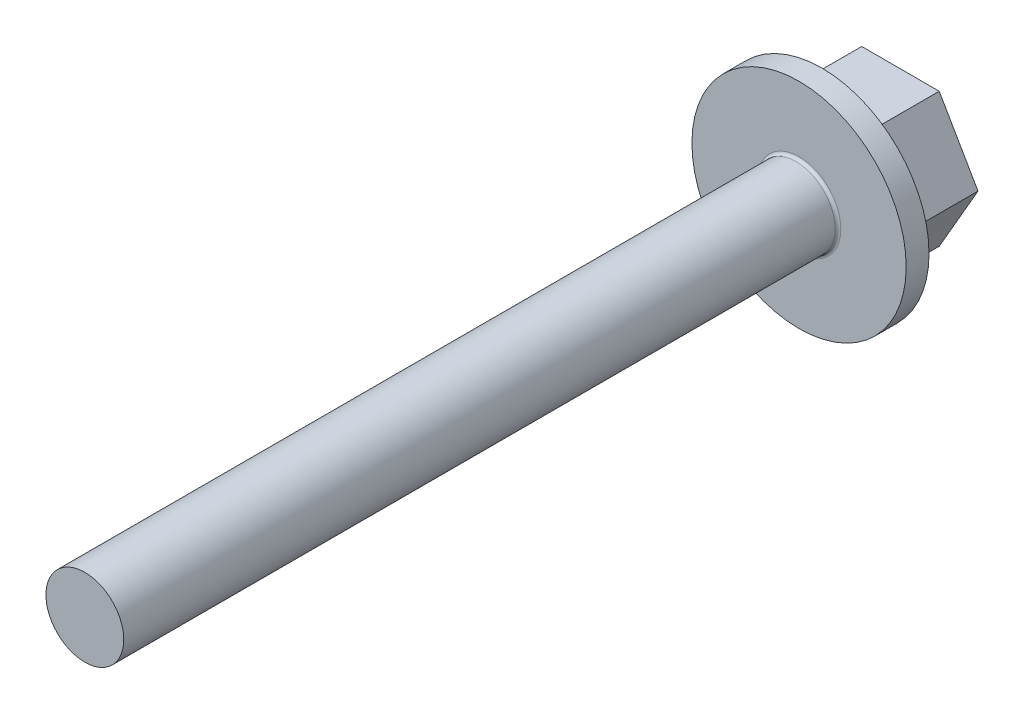
ISO-10303-21;
HEADER;
FILE_DESCRIPTION(('STEP AP214'),'2;1');
FILE_NAME('part.step','',(''),(''),'','','');
FILE_SCHEMA(('AUTOMOTIVE_DESIGN { 1 0 10303 214 1 1 1 1 }'));
ENDSEC;
DATA;
#1=APPLICATION_CONTEXT('core data for automotive mechanical design processes');
#2=APPLICATION_PROTOCOL_DEFINITION('international standard','automotive_design',2000,#1);
#3=PRODUCT_CONTEXT('',#1,'mechanical');
#4=PRODUCT('Part','Part','',(#3));
#5=PRODUCT_RELATED_PRODUCT_CATEGORY('part','',(#4));
#6=PRODUCT_DEFINITION_FORMATION('','',#4);
#7=PRODUCT_DEFINITION_CONTEXT('part definition',#1,'design');
#8=PRODUCT_DEFINITION('design','',#6,#7);
#9=PRODUCT_DEFINITION_SHAPE('','',#8);
#10=(LENGTH_UNIT() NAMED_UNIT(*) SI_UNIT(.MILLI.,.METRE.));
#11=(NAMED_UNIT(*) PLANE_ANGLE_UNIT() SI_UNIT($,.RADIAN.));
#12=(NAMED_UNIT(*) SI_UNIT($,.STERADIAN.) SOLID_ANGLE_UNIT());
#13=UNCERTAINTY_MEASURE_WITH_UNIT(LENGTH_MEASURE(1.E-05),#10,'distance_accuracy_value','');
#14=(GEOMETRIC_REPRESENTATION_CONTEXT(3) GLOBAL_UNCERTAINTY_ASSIGNED_CONTEXT((#13)) GLOBAL_UNIT_ASSIGNED_CONTEXT((#10,
#11,#12)) REPRESENTATION_CONTEXT('',''));
#15=CARTESIAN_POINT('',(0.,0.,0.));
#16=DIRECTION('',(0.,0.,1.));
#17=DIRECTION('',(1.,0.,0.));
#18=AXIS2_PLACEMENT_3D('',#15,#16,#17);
#19=CARTESIAN_POINT('',(1.37848150271715,-2.3876,2.794));
#20=DIRECTION('',(-0.866025403784439,0.5,0.));
#21=DIRECTION('',(-0.5,-0.866025403784439,0.));
#22=AXIS2_PLACEMENT_3D('',#19,#20,#21);
#23=PLANE('',#22);
#24=DIRECTION('',(0.5,0.866025403784439,0.));
#25=VECTOR('',#24,1.);
#26=CARTESIAN_POINT('',(1.37848150271715,-2.3876,0.));
#27=LINE('',#26,#25);
#28=CARTESIAN_POINT('',(1.37848150271715,-2.3876,0.));
#29=VERTEX_POINT('',#28);
#30=CARTESIAN_POINT('',(2.7569630054343,0.,0.));
#31=VERTEX_POINT('',#30);
#32=EDGE_CURVE('E146',#29,#31,#27,.T.);
#33=ORIENTED_EDGE('',*,*,#32,.T.);
#34=DIRECTION('',(0.,0.,-1.));
#35=VECTOR('',#34,1.);
#36=CARTESIAN_POINT('',(2.7569630054343,0.,2.794));
#37=LINE('',#36,#35);
#38=CARTESIAN_POINT('',(2.7569630054343,0.,2.794));
#39=VERTEX_POINT('',#38);
#40=EDGE_CURVE('E171',#39,#31,#37,.T.);
#41=ORIENTED_EDGE('',*,*,#40,.F.);
#42=DIRECTION('',(0.5,0.866025403784439,0.));
#43=VECTOR('',#42,1.);
#44=CARTESIAN_POINT('',(1.37848150271715,-2.3876,2.794));
#45=LINE('',#44,#43);
#46=CARTESIAN_POINT('',(1.37848150271715,-2.3876,2.794));
#47=VERTEX_POINT('',#46);
#48=EDGE_CURVE('E136',#47,#39,#45,.T.);
#49=ORIENTED_EDGE('',*,*,#48,.F.);
#50=DIRECTION('',(0.,0.,-1.));
#51=VECTOR('',#50,1.);
#52=CARTESIAN_POINT('',(1.37848150271715,-2.3876,2.794));
#53=LINE('',#52,#51);
#54=EDGE_CURVE('E145',#47,#29,#53,.T.);
#55=ORIENTED_EDGE('',*,*,#54,.T.);
#56=EDGE_LOOP('',(#33,#41,#49,#55));
#57=FACE_BOUND('',#56,.T.);
#58=ADVANCED_FACE('F45',(#57),#23,.F.);
#59=CARTESIAN_POINT('',(2.7569630054343,0.,2.794));
#60=DIRECTION('',(-0.866025403784439,-0.5,0.));
#61=DIRECTION('',(0.5,-0.866025403784439,0.));
#62=AXIS2_PLACEMENT_3D('',#59,#60,#61);
#63=PLANE('',#62);
#64=DIRECTION('',(-0.5,0.866025403784438,0.));
#65=VECTOR('',#64,1.);
#66=CARTESIAN_POINT('',(2.7569630054343,0.,0.));
#67=LINE('',#66,#65);
#68=CARTESIAN_POINT('',(1.37848150271715,2.3876,0.));
#69=VERTEX_POINT('',#68);
#70=EDGE_CURVE('E150',#31,#69,#67,.T.);
#71=ORIENTED_EDGE('',*,*,#70,.T.);
#72=DIRECTION('',(0.,0.,-1.));
#73=VECTOR('',#72,1.);
#74=CARTESIAN_POINT('',(1.37848150271715,2.3876,2.794));
#75=LINE('',#74,#73);
#76=CARTESIAN_POINT('',(1.37848150271715,2.3876,2.794));
#77=VERTEX_POINT('',#76);
#78=EDGE_CURVE('E119',#77,#69,#75,.T.);
#79=ORIENTED_EDGE('',*,*,#78,.F.);
#80=DIRECTION('',(-0.5,0.866025403784438,0.));
#81=VECTOR('',#80,1.);
#82=CARTESIAN_POINT('',(2.7569630054343,0.,2.794));
#83=LINE('',#82,#81);
#84=EDGE_CURVE('E100',#39,#77,#83,.T.);
#85=ORIENTED_EDGE('',*,*,#84,.F.);
#86=ORIENTED_EDGE('',*,*,#40,.T.);
#87=EDGE_LOOP('',(#71,#79,#85,#86));
#88=FACE_BOUND('',#87,.T.);
#89=ADVANCED_FACE('F191',(#88),#63,.F.);
#90=CARTESIAN_POINT('',(1.37848150271715,2.3876,2.794));
#91=DIRECTION('',(0.,-1.,0.));
#92=DIRECTION('',(1.,0.,0.));
#93=AXIS2_PLACEMENT_3D('',#90,#91,#92);
#94=PLANE('',#93);
#95=DIRECTION('',(-1.,0.,0.));
#96=VECTOR('',#95,1.);
#97=CARTESIAN_POINT('',(1.37848150271715,2.3876,0.));
#98=LINE('',#97,#96);
#99=CARTESIAN_POINT('',(-1.37848150271715,2.3876,0.));
#100=VERTEX_POINT('',#99);
#101=EDGE_CURVE('E115',#69,#100,#98,.T.);
#102=ORIENTED_EDGE('',*,*,#101,.T.);
#103=DIRECTION('',(0.,0.,-1.));
#104=VECTOR('',#103,1.);
#105=CARTESIAN_POINT('',(-1.37848150271715,2.3876,2.794));
#106=LINE('',#105,#104);
#107=CARTESIAN_POINT('',(-1.37848150271715,2.3876,2.794));
#108=VERTEX_POINT('',#107);
#109=EDGE_CURVE('E108',#108,#100,#106,.T.);
#110=ORIENTED_EDGE('',*,*,#109,.F.);
#111=DIRECTION('',(-1.,0.,0.));
#112=VECTOR('',#111,1.);
#113=CARTESIAN_POINT('',(1.37848150271715,2.3876,2.794));
#114=LINE('',#113,#112);
#115=EDGE_CURVE('E113',#77,#108,#114,.T.);
#116=ORIENTED_EDGE('',*,*,#115,.F.);
#117=ORIENTED_EDGE('',*,*,#78,.T.);
#118=EDGE_LOOP('',(#102,#110,#116,#117));
#119=FACE_BOUND('',#118,.T.);
#120=ADVANCED_FACE('F110',(#119),#94,.F.);
#121=CARTESIAN_POINT('',(-1.37848150271715,2.3876,2.794));
#122=DIRECTION('',(0.866025403784439,-0.5,0.));
#123=DIRECTION('',(0.5,0.866025403784438,0.));
#124=AXIS2_PLACEMENT_3D('',#121,#122,#123);
#125=PLANE('',#124);
#126=DIRECTION('',(-0.5,-0.866025403784439,0.));
#127=VECTOR('',#126,1.);
#128=CARTESIAN_POINT('',(-1.37848150271715,2.3876,0.));
#129=LINE('',#128,#127);
#130=CARTESIAN_POINT('',(-2.7569630054343,0.,0.));
#131=VERTEX_POINT('',#130);
#132=EDGE_CURVE('E156',#100,#131,#129,.T.);
#133=ORIENTED_EDGE('',*,*,#132,.T.);
#134=DIRECTION('',(0.,0.,-1.));
#135=VECTOR('',#134,1.);
#136=CARTESIAN_POINT('',(-2.7569630054343,0.,2.794));
#137=LINE('',#136,#135);
#138=CARTESIAN_POINT('',(-2.7569630054343,0.,2.794));
#139=VERTEX_POINT('',#138);
#140=EDGE_CURVE('E120',#139,#131,#137,.T.);
#141=ORIENTED_EDGE('',*,*,#140,.F.);
#142=DIRECTION('',(-0.5,-0.866025403784439,0.));
#143=VECTOR('',#142,1.);
#144=CARTESIAN_POINT('',(-1.37848150271715,2.3876,2.794));
#145=LINE('',#144,#143);
#146=EDGE_CURVE('E123',#108,#139,#145,.T.);
#147=ORIENTED_EDGE('',*,*,#146,.F.);
#148=ORIENTED_EDGE('',*,*,#109,.T.);
#149=EDGE_LOOP('',(#133,#141,#147,#148));
#150=FACE_BOUND('',#149,.T.);
#151=ADVANCED_FACE('F124',(#150),#125,.F.);
#152=CARTESIAN_POINT('',(-2.7569630054343,0.,2.794));
#153=DIRECTION('',(0.866025403784439,0.5,0.));
#154=DIRECTION('',(-0.5,0.866025403784438,0.));
#155=AXIS2_PLACEMENT_3D('',#152,#153,#154);
#156=PLANE('',#155);
#157=DIRECTION('',(0.5,-0.866025403784439,0.));
#158=VECTOR('',#157,1.);
#159=CARTESIAN_POINT('',(-2.7569630054343,0.,0.));
#160=LINE('',#159,#158);
#161=CARTESIAN_POINT('',(-1.37848150271715,-2.3876,0.));
#162=VERTEX_POINT('',#161);
#163=EDGE_CURVE('E85',#131,#162,#160,.T.);
#164=ORIENTED_EDGE('',*,*,#163,.T.);
#165=DIRECTION('',(0.,0.,-1.));
#166=VECTOR('',#165,1.);
#167=CARTESIAN_POINT('',(-1.37848150271715,-2.3876,2.794));
#168=LINE('',#167,#166);
#169=CARTESIAN_POINT('',(-1.37848150271715,-2.3876,2.794));
#170=VERTEX_POINT('',#169);
#171=EDGE_CURVE('E63',#170,#162,#168,.T.);
#172=ORIENTED_EDGE('',*,*,#171,.F.);
#173=DIRECTION('',(0.5,-0.866025403784439,0.));
#174=VECTOR('',#173,1.);
#175=CARTESIAN_POINT('',(-2.7569630054343,0.,2.794));
#176=LINE('',#175,#174);
#177=EDGE_CURVE('E128',#139,#170,#176,.T.);
#178=ORIENTED_EDGE('',*,*,#177,.F.);
#179=ORIENTED_EDGE('',*,*,#140,.T.);
#180=EDGE_LOOP('',(#164,#172,#178,#179));
#181=FACE_BOUND('',#180,.T.);
#182=ADVANCED_FACE('F203',(#181),#156,.F.);
#183=CARTESIAN_POINT('',(-1.37848150271715,-2.3876,2.794));
#184=DIRECTION('',(0.,1.,0.));
#185=DIRECTION('',(0.,0.,1.));
#186=AXIS2_PLACEMENT_3D('',#183,#184,#185);
#187=PLANE('',#186);
#188=DIRECTION('',(1.,0.,0.));
#189=VECTOR('',#188,1.);
#190=CARTESIAN_POINT('',(-1.37848150271715,-2.3876,0.));
#191=LINE('',#190,#189);
#192=EDGE_CURVE('E91',#162,#29,#191,.T.);
#193=ORIENTED_EDGE('',*,*,#192,.T.);
#194=ORIENTED_EDGE('',*,*,#54,.F.);
#195=DIRECTION('',(1.,0.,0.));
#196=VECTOR('',#195,1.);
#197=CARTESIAN_POINT('',(-1.37848150271715,-2.3876,2.794));
#198=LINE('',#197,#196);
#199=EDGE_CURVE('E142',#170,#47,#198,.T.);
#200=ORIENTED_EDGE('',*,*,#199,.F.);
#201=ORIENTED_EDGE('',*,*,#171,.T.);
#202=EDGE_LOOP('',(#193,#194,#200,#201));
#203=FACE_BOUND('',#202,.T.);
#204=ADVANCED_FACE('F206',(#203),#187,.F.);
#205=CARTESIAN_POINT('',(0.,0.,0.));
#206=DIRECTION('',(0.,0.,1.));
#207=DIRECTION('',(1.,0.,0.));
#208=AXIS2_PLACEMENT_3D('',#205,#206,#207);
#209=PLANE('',#208);
#210=ORIENTED_EDGE('',*,*,#32,.F.);
#211=ORIENTED_EDGE('',*,*,#192,.F.);
#212=ORIENTED_EDGE('',*,*,#163,.F.);
#213=ORIENTED_EDGE('',*,*,#132,.F.);
#214=ORIENTED_EDGE('',*,*,#101,.F.);
#215=ORIENTED_EDGE('',*,*,#70,.F.);
#216=EDGE_LOOP('',(#210,#211,#212,#213,#214,#215));
#217=FACE_BOUND('',#216,.T.);
#218=ADVANCED_FACE('F209',(#217),#209,.F.);
#219=CARTESIAN_POINT('',(0.,0.,2.794));
#220=DIRECTION('',(0.,0.,1.));
#221=DIRECTION('',(1.,0.,0.));
#222=AXIS2_PLACEMENT_3D('',#219,#220,#221);
#223=PLANE('',#222);
#224=CARTESIAN_POINT('',(0.,0.,2.794));
#225=DIRECTION('',(0.,0.,1.));
#226=DIRECTION('',(1.,0.,0.));
#227=AXIS2_PLACEMENT_3D('',#224,#225,#226);
#228=CIRCLE('',#227,3.81);
#229=CARTESIAN_POINT('',(3.81,0.,2.794));
#230=VERTEX_POINT('',#229);
#231=EDGE_CURVE('E301',#230,#230,#228,.T.);
#232=ORIENTED_EDGE('',*,*,#231,.F.);
#233=EDGE_LOOP('',(#232));
#234=FACE_BOUND('',#233,.T.);
#235=ORIENTED_EDGE('',*,*,#199,.T.);
#236=ORIENTED_EDGE('',*,*,#48,.T.);
#237=ORIENTED_EDGE('',*,*,#84,.T.);
#238=ORIENTED_EDGE('',*,*,#115,.T.);
#239=ORIENTED_EDGE('',*,*,#146,.T.);
#240=ORIENTED_EDGE('',*,*,#177,.T.);
#241=EDGE_LOOP('',(#235,#236,#237,#238,#239,#240));
#242=FACE_BOUND('',#241,.T.);
#243=ADVANCED_FACE('F131',(#234,#242),#223,.F.);
#244=CARTESIAN_POINT('',(0.,0.,3.6068));
#245=DIRECTION('',(0.,0.,-1.));
#246=DIRECTION('',(-1.,0.,0.));
#247=AXIS2_PLACEMENT_3D('',#244,#245,#246);
#248=CYLINDRICAL_SURFACE('',#247,3.81);
#249=CARTESIAN_POINT('',(0.,0.,3.6068));
#250=DIRECTION('',(0.,0.,1.));
#251=DIRECTION('',(1.,0.,0.));
#252=AXIS2_PLACEMENT_3D('',#249,#250,#251);
#253=CIRCLE('',#252,3.81);
#254=CARTESIAN_POINT('',(3.81,0.,3.6068));
#255=VERTEX_POINT('',#254);
#256=EDGE_CURVE('E151',#255,#255,#253,.T.);
#257=ORIENTED_EDGE('',*,*,#256,.F.);
#258=EDGE_LOOP('',(#257));
#259=FACE_BOUND('',#258,.T.);
#260=ORIENTED_EDGE('',*,*,#231,.T.);
#261=EDGE_LOOP('',(#260));
#262=FACE_BOUND('',#261,.T.);
#263=ADVANCED_FACE('F212',(#259,#262),#248,.T.);
#264=CARTESIAN_POINT('',(0.,0.,3.6068));
#265=DIRECTION('',(0.,0.,1.));
#266=DIRECTION('',(1.,0.,0.));
#267=AXIS2_PLACEMENT_3D('',#264,#265,#266);
#268=PLANE('',#267);
#269=CARTESIAN_POINT('',(0.,0.,3.6068));
#270=DIRECTION('',(0.,0.,1.));
#271=DIRECTION('',(1.,0.,0.));
#272=AXIS2_PLACEMENT_3D('',#269,#270,#271);
#273=CIRCLE('',#272,1.4859);
#274=CARTESIAN_POINT('',(1.4859,0.,3.6068));
#275=VERTEX_POINT('',#274);
#276=EDGE_CURVE('E11',#275,#275,#273,.F.);
#277=ORIENTED_EDGE('',*,*,#276,.T.);
#278=EDGE_LOOP('',(#277));
#279=FACE_BOUND('',#278,.T.);
#280=ORIENTED_EDGE('',*,*,#256,.T.);
#281=EDGE_LOOP('',(#280));
#282=FACE_BOUND('',#281,.T.);
#283=ADVANCED_FACE('F215',(#279,#282),#268,.T.);
#284=CARTESIAN_POINT('',(0.,0.,29.0068));
#285=DIRECTION('',(0.,0.,-1.));
#286=DIRECTION('',(-1.,0.,0.));
#287=AXIS2_PLACEMENT_3D('',#284,#285,#286);
#288=CYLINDRICAL_SURFACE('',#287,1.3843);
#289=CARTESIAN_POINT('',(0.,0.,3.7084));
#290=DIRECTION('',(0.,0.,1.));
#291=DIRECTION('',(1.,0.,0.));
#292=AXIS2_PLACEMENT_3D('',#289,#290,#291);
#293=CIRCLE('',#292,1.3843);
#294=CARTESIAN_POINT('',(1.3843,0.,3.7084));
#295=VERTEX_POINT('',#294);
#296=EDGE_CURVE('E55',#295,#295,#293,.T.);
#297=ORIENTED_EDGE('',*,*,#296,.T.);
#298=EDGE_LOOP('',(#297));
#299=FACE_BOUND('',#298,.T.);
#300=CARTESIAN_POINT('',(0.,0.,29.0068));
#301=DIRECTION('',(0.,0.,1.));
#302=DIRECTION('',(1.,0.,0.));
#303=AXIS2_PLACEMENT_3D('',#300,#301,#302);
#304=CIRCLE('',#303,1.3843);
#305=CARTESIAN_POINT('',(1.3843,0.,29.0068));
#306=VERTEX_POINT('',#305);
#307=EDGE_CURVE('E305',#306,#306,#304,.T.);
#308=ORIENTED_EDGE('',*,*,#307,.F.);
#309=EDGE_LOOP('',(#308));
#310=FACE_BOUND('',#309,.T.);
#311=ADVANCED_FACE('F177',(#299,#310),#288,.T.);
#312=CARTESIAN_POINT('',(0.,0.,29.0068));
#313=DIRECTION('',(0.,0.,1.));
#314=DIRECTION('',(1.,0.,0.));
#315=AXIS2_PLACEMENT_3D('',#312,#313,#314);
#316=PLANE('',#315);
#317=ORIENTED_EDGE('',*,*,#307,.T.);
#318=EDGE_LOOP('',(#317));
#319=FACE_BOUND('',#318,.T.);
#320=ADVANCED_FACE('F181',(#319),#316,.T.);
#321=CARTESIAN_POINT('',(0.,0.,3.7084));
#322=DIRECTION('',(0.,0.,1.));
#323=DIRECTION('',(1.,0.,0.));
#324=AXIS2_PLACEMENT_3D('',#321,#322,#323);
#325=TOROIDAL_SURFACE('',#324,1.4859,0.1016);
#326=ORIENTED_EDGE('',*,*,#276,.F.);
#327=EDGE_LOOP('',(#326));
#328=FACE_BOUND('',#327,.T.);
#329=ORIENTED_EDGE('',*,*,#296,.F.);
#330=EDGE_LOOP('',(#329));
#331=FACE_BOUND('',#330,.T.);
#332=ADVANCED_FACE('F47',(#328,#331),#325,.F.);
#333=CLOSED_SHELL('',(#58,#89,#120,#151,#182,#204,#218,#243,#263,#283,#311,#320,#332));
#334=MANIFOLD_SOLID_BREP('B2',#333);
#335=ADVANCED_BREP_SHAPE_REPRESENTATION('',(#18,#334),#14);
#336=SHAPE_DEFINITION_REPRESENTATION(#9,#335);
ENDSEC;
END-ISO-10303-21;
